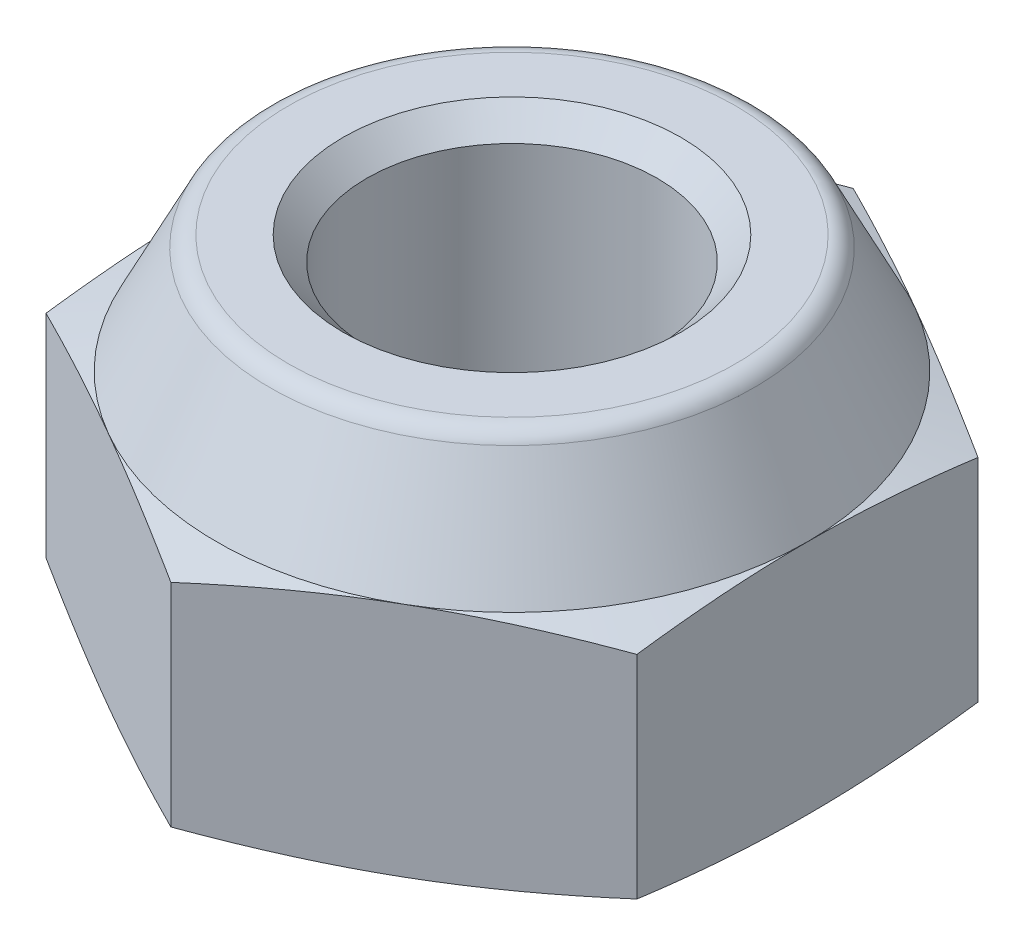
ISO-10303-21;
HEADER;
FILE_DESCRIPTION(('STEP AP214'),'2;1');
FILE_NAME('part.step','',(''),(''),'','','');
FILE_SCHEMA(('AUTOMOTIVE_DESIGN { 1 0 10303 214 1 1 1 1 }'));
ENDSEC;
DATA;
#1=APPLICATION_CONTEXT('core data for automotive mechanical design processes');
#2=APPLICATION_PROTOCOL_DEFINITION('international standard','automotive_design',2000,#1);
#3=PRODUCT_CONTEXT('',#1,'mechanical');
#4=PRODUCT('Part','Part','',(#3));
#5=PRODUCT_RELATED_PRODUCT_CATEGORY('part','',(#4));
#6=PRODUCT_DEFINITION_FORMATION('','',#4);
#7=PRODUCT_DEFINITION_CONTEXT('part definition',#1,'design');
#8=PRODUCT_DEFINITION('design','',#6,#7);
#9=PRODUCT_DEFINITION_SHAPE('','',#8);
#10=(LENGTH_UNIT() NAMED_UNIT(*) SI_UNIT(.MILLI.,.METRE.));
#11=(NAMED_UNIT(*) PLANE_ANGLE_UNIT() SI_UNIT($,.RADIAN.));
#12=(NAMED_UNIT(*) SI_UNIT($,.STERADIAN.) SOLID_ANGLE_UNIT());
#13=UNCERTAINTY_MEASURE_WITH_UNIT(LENGTH_MEASURE(1.E-05),#10,'distance_accuracy_value','');
#14=(GEOMETRIC_REPRESENTATION_CONTEXT(3) GLOBAL_UNCERTAINTY_ASSIGNED_CONTEXT((#13)) GLOBAL_UNIT_ASSIGNED_CONTEXT((#10,
#11,#12)) REPRESENTATION_CONTEXT('',''));
#15=CARTESIAN_POINT('',(0.,0.,0.));
#16=DIRECTION('',(0.,0.,1.));
#17=DIRECTION('',(1.,0.,0.));
#18=AXIS2_PLACEMENT_3D('',#15,#16,#17);
#19=CARTESIAN_POINT('',(0.,6.,0.));
#20=DIRECTION('',(0.,-1.,0.));
#21=DIRECTION('',(0.,0.,-1.));
#22=AXIS2_PLACEMENT_3D('',#19,#20,#21);
#23=PLANE('',#22);
#24=CARTESIAN_POINT('',(0.,6.,0.));
#25=DIRECTION('',(0.,-1.,0.));
#26=DIRECTION('',(0.,0.,-1.));
#27=AXIS2_PLACEMENT_3D('',#24,#25,#26);
#28=CIRCLE('',#27,2.8585);
#29=CARTESIAN_POINT('',(0.,6.,-2.8585));
#30=VERTEX_POINT('',#29);
#31=EDGE_CURVE('E580',#30,#30,#28,.T.);
#32=ORIENTED_EDGE('',*,*,#31,.T.);
#33=EDGE_LOOP('',(#32));
#34=FACE_BOUND('',#33,.T.);
#35=CARTESIAN_POINT('',(0.,6.,0.));
#36=DIRECTION('',(0.,-1.,0.));
#37=DIRECTION('',(0.,0.,-1.));
#38=AXIS2_PLACEMENT_3D('',#35,#36,#37);
#39=CIRCLE('',#38,3.78368810393743);
#40=CARTESIAN_POINT('',(0.,6.,-3.78368810393743));
#41=VERTEX_POINT('',#40);
#42=EDGE_CURVE('E583',#41,#41,#39,.T.);
#43=ORIENTED_EDGE('',*,*,#42,.F.);
#44=EDGE_LOOP('',(#43));
#45=FACE_BOUND('',#44,.T.);
#46=ADVANCED_FACE('F17',(#34,#45),#23,.F.);
#47=CARTESIAN_POINT('',(0.,5.64999999999983,0.));
#48=DIRECTION('',(0.,-1.,0.));
#49=DIRECTION('',(0.,0.,-1.));
#50=AXIS2_PLACEMENT_3D('',#47,#48,#49);
#51=TOROIDAL_SURFACE('',#50,3.78368810393743,0.350000000000169);
#52=ORIENTED_EDGE('',*,*,#42,.T.);
#53=EDGE_LOOP('',(#52));
#54=FACE_BOUND('',#53,.T.);
#55=CARTESIAN_POINT('',(0.,5.806524758425,0.));
#56=DIRECTION('',(0.,-1.,0.));
#57=DIRECTION('',(0.,0.,-1.));
#58=AXIS2_PLACEMENT_3D('',#55,#56,#57);
#59=CIRCLE('',#58,4.0967376207875);
#60=CARTESIAN_POINT('',(0.,5.806524758425,-4.0967376207875));
#61=VERTEX_POINT('',#60);
#62=EDGE_CURVE('E148',#61,#61,#59,.T.);
#63=ORIENTED_EDGE('',*,*,#62,.F.);
#64=EDGE_LOOP('',(#63));
#65=FACE_BOUND('',#64,.T.);
#66=ADVANCED_FACE('F570',(#54,#65),#51,.T.);
#67=CARTESIAN_POINT('',(0.,5.806524758425,0.));
#68=DIRECTION('',(0.,-1.,0.));
#69=DIRECTION('',(0.,0.,-1.));
#70=AXIS2_PLACEMENT_3D('',#67,#68,#69);
#71=CONICAL_SURFACE('',#70,4.0967376207875,0.463647609000806);
#72=CARTESIAN_POINT('',(0.,4.,0.));
#73=DIRECTION('',(0.,-1.,0.));
#74=DIRECTION('',(0.50000000000001,0.,-0.866025403784433));
#75=AXIS2_PLACEMENT_3D('',#72,#73,#74);
#76=CIRCLE('',#75,5.);
#77=CARTESIAN_POINT('',(2.50000000000005,4.,-4.33012701892217));
#78=VERTEX_POINT('',#77);
#79=CARTESIAN_POINT('',(5.,4.,0.));
#80=VERTEX_POINT('',#79);
#81=EDGE_CURVE('E132',#78,#80,#76,.T.);
#82=ORIENTED_EDGE('',*,*,#81,.F.);
#83=CARTESIAN_POINT('',(0.,4.,0.));
#84=DIRECTION('',(0.,-1.,0.));
#85=DIRECTION('',(-0.50000000000001,0.,-0.866025403784433));
#86=AXIS2_PLACEMENT_3D('',#83,#84,#85);
#87=CIRCLE('',#86,5.);
#88=CARTESIAN_POINT('',(-2.50000000000005,4.,-4.33012701892217));
#89=VERTEX_POINT('',#88);
#90=EDGE_CURVE('E143',#89,#78,#87,.T.);
#91=ORIENTED_EDGE('',*,*,#90,.F.);
#92=CARTESIAN_POINT('',(0.,4.,0.));
#93=DIRECTION('',(0.,-1.,0.));
#94=DIRECTION('',(-1.,0.,0.));
#95=AXIS2_PLACEMENT_3D('',#92,#93,#94);
#96=CIRCLE('',#95,5.);
#97=CARTESIAN_POINT('',(-5.,4.,0.));
#98=VERTEX_POINT('',#97);
#99=EDGE_CURVE('E152',#98,#89,#96,.T.);
#100=ORIENTED_EDGE('',*,*,#99,.F.);
#101=CARTESIAN_POINT('',(0.,4.,0.));
#102=DIRECTION('',(0.,-1.,0.));
#103=DIRECTION('',(-0.500000000000009,0.,0.866025403784433));
#104=AXIS2_PLACEMENT_3D('',#101,#102,#103);
#105=CIRCLE('',#104,5.);
#106=CARTESIAN_POINT('',(-2.50000000000005,4.,4.33012701892217));
#107=VERTEX_POINT('',#106);
#108=EDGE_CURVE('E154',#107,#98,#105,.T.);
#109=ORIENTED_EDGE('',*,*,#108,.F.);
#110=CARTESIAN_POINT('',(0.,4.,0.));
#111=DIRECTION('',(0.,-1.,0.));
#112=DIRECTION('',(0.50000000000001,0.,0.866025403784433));
#113=AXIS2_PLACEMENT_3D('',#110,#111,#112);
#114=CIRCLE('',#113,5.);
#115=CARTESIAN_POINT('',(2.50000000000005,4.,4.33012701892217));
#116=VERTEX_POINT('',#115);
#117=EDGE_CURVE('E165',#116,#107,#114,.T.);
#118=ORIENTED_EDGE('',*,*,#117,.F.);
#119=CARTESIAN_POINT('',(0.,4.,0.));
#120=DIRECTION('',(0.,-1.,0.));
#121=DIRECTION('',(1.,0.,0.));
#122=AXIS2_PLACEMENT_3D('',#119,#120,#121);
#123=CIRCLE('',#122,5.);
#124=EDGE_CURVE('E147',#80,#116,#123,.T.);
#125=ORIENTED_EDGE('',*,*,#124,.F.);
#126=EDGE_LOOP('',(#82,#91,#100,#109,#118,#125));
#127=FACE_BOUND('',#126,.T.);
#128=ORIENTED_EDGE('',*,*,#62,.T.);
#129=EDGE_LOOP('',(#128));
#130=FACE_BOUND('',#129,.T.);
#131=ADVANCED_FACE('F140',(#127,#130),#71,.T.);
#132=CARTESIAN_POINT('',(0.,4.,0.));
#133=DIRECTION('',(0.,-1.,0.));
#134=DIRECTION('',(0.,0.,-1.));
#135=AXIS2_PLACEMENT_3D('',#132,#133,#134);
#136=CONICAL_SURFACE('',#135,5.,1.30899693899575);
#137=CARTESIAN_POINT('',(-2.50000000000005,4.,4.33012701892217));
#138=CARTESIAN_POINT('',(-2.91742640279352,4.,4.0891257729025));
#139=CARTESIAN_POINT('',(-3.33341692083685,3.9810548741823,3.84895353532985));
#140=CARTESIAN_POINT('',(-4.16754617694872,3.90945077234265,3.3673687847747));
#141=CARTESIAN_POINT('',(-4.584721111361,3.85698444601377,3.1265127240926));
#142=CARTESIAN_POINT('',(-5.00000000003527,3.79274057835765,2.88675134592774));
#143=B_SPLINE_CURVE_WITH_KNOTS('',3,(#137,#138,#139,#140,#141,#142),.UNSPECIFIED.,.F.,.F.,(4,2,
4),(2.88698228605588,4.33035795902993,5.77373363200397),.UNSPECIFIED.);
#144=CARTESIAN_POINT('',(-5.,3.79274057836311,2.8867513459481));
#145=VERTEX_POINT('',#144);
#146=EDGE_CURVE('E173',#107,#145,#143,.T.);
#147=ORIENTED_EDGE('',*,*,#146,.F.);
#148=ORIENTED_EDGE('',*,*,#108,.T.);
#149=CARTESIAN_POINT('',(-5.,3.79274057884869,2.88675134232365));
#150=CARTESIAN_POINT('',(-5.,3.85673262713977,2.40910819086845));
#151=CARTESIAN_POINT('',(-5.,3.90889964404098,1.9311751947153));
#152=CARTESIAN_POINT('',(-5.,3.98076156598478,0.96802648577754));
#153=CARTESIAN_POINT('',(-5.,3.99999987620716,0.483903345265922));
#154=CARTESIAN_POINT('',(-5.,3.99999999999939,4.77371612118277E-06));
#155=B_SPLINE_CURVE_WITH_KNOTS('',3,(#149,#150,#151,#152,#153,#154),.UNSPECIFIED.,.F.,.F.,(4,2,
4),(5.90985445442545,7.35450546166115,8.79915646889685),.UNSPECIFIED.);
#156=EDGE_CURVE('E481',#145,#98,#155,.T.);
#157=ORIENTED_EDGE('',*,*,#156,.F.);
#158=EDGE_LOOP('',(#147,#148,#157));
#159=FACE_BOUND('',#158,.T.);
#160=ADVANCED_FACE('F187',(#159),#136,.T.);
#161=ORIENTED_EDGE('',*,*,#117,.T.);
#162=CARTESIAN_POINT('',(3.52677956283465E-11,3.79274057835763,5.77350269191666));
#163=CARTESIAN_POINT('',(-0.415278888639018,3.85698444601376,5.53374131375179));
#164=CARTESIAN_POINT('',(-0.832453823051313,3.90945077234264,5.29288525306968));
#165=CARTESIAN_POINT('',(-1.66658307916322,3.9810548741823,4.81130050251452));
#166=CARTESIAN_POINT('',(-2.08257359720656,4.,4.57112826494186));
#167=CARTESIAN_POINT('',(-2.50000000000005,4.,4.33012701892217));
#168=B_SPLINE_CURVE_WITH_KNOTS('',3,(#162,#163,#164,#165,#166,#167),.UNSPECIFIED.,.F.,.F.,(4,2,
4),(0.00023094010767716,1.44360661308178,2.88698228605588),.UNSPECIFIED.);
#169=CARTESIAN_POINT('',(0.,3.79274057836309,5.7735026918963));
#170=VERTEX_POINT('',#169);
#171=EDGE_CURVE('E258',#170,#107,#168,.T.);
#172=ORIENTED_EDGE('',*,*,#171,.F.);
#173=CARTESIAN_POINT('',(2.50000000000005,4.,4.33012701892217));
#174=CARTESIAN_POINT('',(2.08257359720656,4.,4.57112826494186));
#175=CARTESIAN_POINT('',(1.66658307916322,3.9810548741823,4.81130050251451));
#176=CARTESIAN_POINT('',(0.832453823051316,3.90945077234264,5.29288525306968));
#177=CARTESIAN_POINT('',(0.41527888863902,3.85698444601376,5.53374131375179));
#178=CARTESIAN_POINT('',(-3.52666476268507E-11,3.79274057835763,5.77350269191666));
#179=B_SPLINE_CURVE_WITH_KNOTS('',3,(#173,#174,#175,#176,#177,#178),.UNSPECIFIED.,.F.,.F.,(4,2,
4),(2.88698228605576,4.33035795902987,5.77373363200397),.UNSPECIFIED.);
#180=EDGE_CURVE('E257',#116,#170,#179,.T.);
#181=ORIENTED_EDGE('',*,*,#180,.F.);
#182=EDGE_LOOP('',(#161,#172,#181));
#183=FACE_BOUND('',#182,.T.);
#184=ADVANCED_FACE('F197',(#183),#136,.T.);
#185=ORIENTED_EDGE('',*,*,#124,.T.);
#186=CARTESIAN_POINT('',(5.00000000003527,3.79274057835765,2.88675134592774));
#187=CARTESIAN_POINT('',(4.584721111361,3.85698444601377,3.1265127240926));
#188=CARTESIAN_POINT('',(4.16754617694872,3.90945077234265,3.3673687847747));
#189=CARTESIAN_POINT('',(3.33341692083685,3.9810548741823,3.84895353532985));
#190=CARTESIAN_POINT('',(2.91742640279352,4.,4.0891257729025));
#191=CARTESIAN_POINT('',(2.50000000000005,4.,4.33012701892217));
#192=B_SPLINE_CURVE_WITH_KNOTS('',3,(#186,#187,#188,#189,#190,#191),.UNSPECIFIED.,.F.,.F.,(4,2,
4),(0.000230940107676231,1.44360661308172,2.88698228605576),.UNSPECIFIED.);
#193=CARTESIAN_POINT('',(5.,3.79274057836311,2.8867513459481));
#194=VERTEX_POINT('',#193);
#195=EDGE_CURVE('E263',#194,#116,#192,.T.);
#196=ORIENTED_EDGE('',*,*,#195,.F.);
#197=CARTESIAN_POINT('',(5.,3.99999999999939,-4.77371611901437E-06));
#198=CARTESIAN_POINT('',(5.,4.00000012642146,0.494173763804613));
#199=CARTESIAN_POINT('',(5.,3.98008346483984,0.986439161312405));
#200=CARTESIAN_POINT('',(5.,3.90682459228383,1.94954335929095));
#201=CARTESIAN_POINT('',(5.,3.85536900052761,2.41928641532904));
#202=CARTESIAN_POINT('',(5.,3.79274060438282,2.88675115173431));
#203=B_SPLINE_CURVE_WITH_KNOTS('',3,(#197,#198,#199,#200,#201,#202),.UNSPECIFIED.,.F.,.F.,(4,2,
4),(8.79915646889686,10.2610602443896,11.650099917217),.UNSPECIFIED.);
#204=EDGE_CURVE('E268',#80,#194,#203,.T.);
#205=ORIENTED_EDGE('',*,*,#204,.F.);
#206=EDGE_LOOP('',(#185,#196,#205));
#207=FACE_BOUND('',#206,.T.);
#208=ADVANCED_FACE('F267',(#207),#136,.T.);
#209=ORIENTED_EDGE('',*,*,#81,.T.);
#210=CARTESIAN_POINT('',(5.,3.79274057884869,-2.88675134232365));
#211=CARTESIAN_POINT('',(5.,3.85673262713977,-2.40910819086844));
#212=CARTESIAN_POINT('',(5.,3.90889964404098,-1.9311751947153));
#213=CARTESIAN_POINT('',(5.,3.98076156598478,-0.968026485777538));
#214=CARTESIAN_POINT('',(5.,3.99999987620716,-0.48390334526592));
#215=CARTESIAN_POINT('',(5.,3.99999999999939,-4.77371611901437E-06));
#216=B_SPLINE_CURVE_WITH_KNOTS('',3,(#210,#211,#212,#213,#214,#215),.UNSPECIFIED.,.F.,.F.,(4,2,
4),(5.90985445442545,7.35450546166115,8.79915646889686),.UNSPECIFIED.);
#217=CARTESIAN_POINT('',(5.,3.79274057836311,-2.8867513459481));
#218=VERTEX_POINT('',#217);
#219=EDGE_CURVE('E133',#218,#80,#216,.T.);
#220=ORIENTED_EDGE('',*,*,#219,.F.);
#221=CARTESIAN_POINT('',(2.50000000000005,4.,-4.33012701892217));
#222=CARTESIAN_POINT('',(2.91742640279352,4.,-4.0891257729025));
#223=CARTESIAN_POINT('',(3.33341692083685,3.9810548741823,-3.84895353532985));
#224=CARTESIAN_POINT('',(4.16754617694872,3.90945077234265,-3.3673687847747));
#225=CARTESIAN_POINT('',(4.584721111361,3.85698444601377,-3.1265127240926));
#226=CARTESIAN_POINT('',(5.00000000003527,3.79274057835765,-2.88675134592774));
#227=B_SPLINE_CURVE_WITH_KNOTS('',3,(#221,#222,#223,#224,#225,#226),.UNSPECIFIED.,.F.,.F.,(4,2,
4),(2.88698228605588,4.33035795902993,5.77373363200397),.UNSPECIFIED.);
#228=EDGE_CURVE('E113',#78,#218,#227,.T.);
#229=ORIENTED_EDGE('',*,*,#228,.F.);
#230=EDGE_LOOP('',(#209,#220,#229));
#231=FACE_BOUND('',#230,.T.);
#232=ADVANCED_FACE('F131',(#231),#136,.T.);
#233=ORIENTED_EDGE('',*,*,#90,.T.);
#234=CARTESIAN_POINT('',(-3.52677956283465E-11,3.79274057835763,-5.77350269191666));
#235=CARTESIAN_POINT('',(0.415278888639019,3.85698444601376,-5.53374131375179));
#236=CARTESIAN_POINT('',(0.832453823051315,3.90945077234264,-5.29288525306968));
#237=CARTESIAN_POINT('',(1.66658307916322,3.9810548741823,-4.81130050251451));
#238=CARTESIAN_POINT('',(2.08257359720656,4.,-4.57112826494186));
#239=CARTESIAN_POINT('',(2.50000000000005,4.,-4.33012701892217));
#240=B_SPLINE_CURVE_WITH_KNOTS('',3,(#234,#235,#236,#237,#238,#239),.UNSPECIFIED.,.F.,.F.,(4,2,
4),(0.00023094010767716,1.44360661308178,2.88698228605588),.UNSPECIFIED.);
#241=CARTESIAN_POINT('',(0.,3.79274057836309,-5.7735026918963));
#242=VERTEX_POINT('',#241);
#243=EDGE_CURVE('E108',#242,#78,#240,.T.);
#244=ORIENTED_EDGE('',*,*,#243,.F.);
#245=CARTESIAN_POINT('',(-2.50000000000005,4.,-4.33012701892217));
#246=CARTESIAN_POINT('',(-2.08257359720656,4.,-4.57112826494186));
#247=CARTESIAN_POINT('',(-1.66658307916322,3.9810548741823,-4.81130050251451));
#248=CARTESIAN_POINT('',(-0.832453823051316,3.90945077234264,-5.29288525306968));
#249=CARTESIAN_POINT('',(-0.41527888863902,3.85698444601376,-5.53374131375179));
#250=CARTESIAN_POINT('',(3.52660132341329E-11,3.79274057835763,-5.77350269191666));
#251=B_SPLINE_CURVE_WITH_KNOTS('',3,(#245,#246,#247,#248,#249,#250),.UNSPECIFIED.,.F.,.F.,(4,2,
4),(2.88698228605576,4.33035795902987,5.77373363200397),.UNSPECIFIED.);
#252=EDGE_CURVE('E123',#89,#242,#251,.T.);
#253=ORIENTED_EDGE('',*,*,#252,.F.);
#254=EDGE_LOOP('',(#233,#244,#253));
#255=FACE_BOUND('',#254,.T.);
#256=ADVANCED_FACE('F150',(#255),#136,.T.);
#257=ORIENTED_EDGE('',*,*,#99,.T.);
#258=CARTESIAN_POINT('',(-5.00000000003527,3.79274057835765,-2.88675134592774));
#259=CARTESIAN_POINT('',(-4.584721111361,3.85698444601377,-3.1265127240926));
#260=CARTESIAN_POINT('',(-4.16754617694872,3.90945077234265,-3.3673687847747));
#261=CARTESIAN_POINT('',(-3.33341692083685,3.9810548741823,-3.84895353532985));
#262=CARTESIAN_POINT('',(-2.91742640279353,4.,-4.0891257729025));
#263=CARTESIAN_POINT('',(-2.50000000000005,4.,-4.33012701892217));
#264=B_SPLINE_CURVE_WITH_KNOTS('',3,(#258,#259,#260,#261,#262,#263),.UNSPECIFIED.,.F.,.F.,(4,2,
4),(0.000230940107676231,1.44360661308172,2.88698228605576),.UNSPECIFIED.);
#265=CARTESIAN_POINT('',(-5.,3.79274057836311,-2.8867513459481));
#266=VERTEX_POINT('',#265);
#267=EDGE_CURVE('E424',#266,#89,#264,.T.);
#268=ORIENTED_EDGE('',*,*,#267,.F.);
#269=CARTESIAN_POINT('',(-5.,3.99999999999939,4.77371612118277E-06));
#270=CARTESIAN_POINT('',(-5.,4.00000012642146,-0.494173763804612));
#271=CARTESIAN_POINT('',(-5.,3.98008346483984,-0.986439161312404));
#272=CARTESIAN_POINT('',(-5.,3.90682459228383,-1.94954335929095));
#273=CARTESIAN_POINT('',(-5.,3.85536900052761,-2.41928641532904));
#274=CARTESIAN_POINT('',(-5.,3.79274060438282,-2.88675115173432));
#275=B_SPLINE_CURVE_WITH_KNOTS('',3,(#269,#270,#271,#272,#273,#274),.UNSPECIFIED.,.F.,.F.,(4,2,
4),(8.79915646889685,10.2610602443896,11.650099917217),.UNSPECIFIED.);
#276=EDGE_CURVE('E480',#98,#266,#275,.T.);
#277=ORIENTED_EDGE('',*,*,#276,.F.);
#278=EDGE_LOOP('',(#257,#268,#277));
#279=FACE_BOUND('',#278,.T.);
#280=ADVANCED_FACE('F198',(#279),#136,.T.);
#281=CARTESIAN_POINT('',(-5.,4.,2.8867513459481));
#282=DIRECTION('',(0.500000000000009,0.,-0.866025403784433));
#283=DIRECTION('',(-0.866025403784433,0.,-0.500000000000009));
#284=AXIS2_PLACEMENT_3D('',#281,#282,#283);
#285=PLANE('',#284);
#286=DIRECTION('',(0.,-1.,0.));
#287=VECTOR('',#286,1.);
#288=CARTESIAN_POINT('',(-5.,3.79274057836311,2.8867513459481));
#289=LINE('',#288,#287);
#290=CARTESIAN_POINT('',(-5.,0.207259421636899,2.8867513459481));
#291=VERTEX_POINT('',#290);
#292=EDGE_CURVE('E483',#145,#291,#289,.T.);
#293=ORIENTED_EDGE('',*,*,#292,.T.);
#294=CARTESIAN_POINT('',(-5.00000000003527,0.207259421642354,2.88675134592774));
#295=CARTESIAN_POINT('',(-4.584721111361,0.143015553986228,3.1265127240926));
#296=CARTESIAN_POINT('',(-4.16754617694872,0.0905492276573553,3.3673687847747));
#297=CARTESIAN_POINT('',(-3.33341692083684,0.018945125817702,3.84895353532985));
#298=CARTESIAN_POINT('',(-2.91742640279352,0.,4.0891257729025));
#299=CARTESIAN_POINT('',(-2.50000000000005,0.,4.33012701892217));
#300=B_SPLINE_CURVE_WITH_KNOTS('',3,(#294,#295,#296,#297,#298,#299),.UNSPECIFIED.,.F.,.F.,(4,2,
4),(0.000230940107674021,1.44360661308172,2.88698228605576),.UNSPECIFIED.);
#301=CARTESIAN_POINT('',(-2.50000000000005,0.,4.33012701892217));
#302=VERTEX_POINT('',#301);
#303=EDGE_CURVE('E859',#291,#302,#300,.T.);
#304=ORIENTED_EDGE('',*,*,#303,.T.);
#305=CARTESIAN_POINT('',(-2.50000000000005,0.,4.33012701892217));
#306=CARTESIAN_POINT('',(-2.08257359720656,0.,4.57112826494186));
#307=CARTESIAN_POINT('',(-1.66658307916322,0.0189451258177029,4.81130050251452));
#308=CARTESIAN_POINT('',(-0.832453823051313,0.0905492276573614,5.29288525306968));
#309=CARTESIAN_POINT('',(-0.415278888639018,0.143015553986238,5.53374131375179));
#310=CARTESIAN_POINT('',(3.52677956283465E-11,0.207259421642369,5.77350269191666));
#311=B_SPLINE_CURVE_WITH_KNOTS('',3,(#305,#306,#307,#308,#309,#310),.UNSPECIFIED.,.F.,.F.,(4,2,
4),(2.88698228605576,4.33035795902986,5.77373363200397),.UNSPECIFIED.);
#312=CARTESIAN_POINT('',(0.,0.207259421636915,5.7735026918963));
#313=VERTEX_POINT('',#312);
#314=EDGE_CURVE('E542',#302,#313,#311,.T.);
#315=ORIENTED_EDGE('',*,*,#314,.T.);
#316=DIRECTION('',(0.,-1.,0.));
#317=VECTOR('',#316,1.);
#318=CARTESIAN_POINT('',(0.,3.79274057836309,5.7735026918963));
#319=LINE('',#318,#317);
#320=EDGE_CURVE('E504',#170,#313,#319,.T.);
#321=ORIENTED_EDGE('',*,*,#320,.F.);
#322=ORIENTED_EDGE('',*,*,#171,.T.);
#323=ORIENTED_EDGE('',*,*,#146,.T.);
#324=EDGE_LOOP('',(#293,#304,#315,#321,#322,#323));
#325=FACE_BOUND('',#324,.T.);
#326=ADVANCED_FACE('F200',(#325),#285,.F.);
#327=CARTESIAN_POINT('',(0.,4.,5.7735026918963));
#328=DIRECTION('',(-0.500000000000009,0.,-0.866025403784433));
#329=DIRECTION('',(-0.866025403784433,0.,0.500000000000009));
#330=AXIS2_PLACEMENT_3D('',#327,#328,#329);
#331=PLANE('',#330);
#332=ORIENTED_EDGE('',*,*,#320,.T.);
#333=CARTESIAN_POINT('',(-3.52683106526997E-11,0.20725942164237,5.77350269191666));
#334=CARTESIAN_POINT('',(0.415278888639019,0.143015553986239,5.53374131375179));
#335=CARTESIAN_POINT('',(0.832453823051316,0.0905492276573622,5.29288525306968));
#336=CARTESIAN_POINT('',(1.66658307916322,0.0189451258177029,4.81130050251451));
#337=CARTESIAN_POINT('',(2.08257359720656,0.,4.57112826494186));
#338=CARTESIAN_POINT('',(2.50000000000005,0.,4.33012701892217));
#339=B_SPLINE_CURVE_WITH_KNOTS('',3,(#333,#334,#335,#336,#337,#338),.UNSPECIFIED.,.F.,.F.,(4,2,
4),(0.00023094010767713,1.44360661308178,2.88698228605588),.UNSPECIFIED.);
#340=CARTESIAN_POINT('',(2.50000000000005,0.,4.33012701892217));
#341=VERTEX_POINT('',#340);
#342=EDGE_CURVE('E501',#313,#341,#339,.T.);
#343=ORIENTED_EDGE('',*,*,#342,.T.);
#344=CARTESIAN_POINT('',(2.50000000000005,0.,4.33012701892217));
#345=CARTESIAN_POINT('',(2.91742640279352,0.,4.0891257729025));
#346=CARTESIAN_POINT('',(3.33341692083684,0.018945125817702,3.84895353532985));
#347=CARTESIAN_POINT('',(4.16754617694872,0.0905492276573553,3.3673687847747));
#348=CARTESIAN_POINT('',(4.584721111361,0.143015553986228,3.1265127240926));
#349=CARTESIAN_POINT('',(5.00000000003527,0.207259421642354,2.88675134592774));
#350=B_SPLINE_CURVE_WITH_KNOTS('',3,(#344,#345,#346,#347,#348,#349),.UNSPECIFIED.,.F.,.F.,(4,2,
4),(2.88698228605588,4.33035795902993,5.77373363200397),.UNSPECIFIED.);
#351=CARTESIAN_POINT('',(5.,0.207259421636899,2.8867513459481));
#352=VERTEX_POINT('',#351);
#353=EDGE_CURVE('E503',#341,#352,#350,.T.);
#354=ORIENTED_EDGE('',*,*,#353,.T.);
#355=DIRECTION('',(0.,-1.,0.));
#356=VECTOR('',#355,1.);
#357=CARTESIAN_POINT('',(5.,3.79274057836311,2.8867513459481));
#358=LINE('',#357,#356);
#359=EDGE_CURVE('E276',#194,#352,#358,.T.);
#360=ORIENTED_EDGE('',*,*,#359,.F.);
#361=ORIENTED_EDGE('',*,*,#195,.T.);
#362=ORIENTED_EDGE('',*,*,#180,.T.);
#363=EDGE_LOOP('',(#332,#343,#354,#360,#361,#362));
#364=FACE_BOUND('',#363,.T.);
#365=ADVANCED_FACE('F274',(#364),#331,.F.);
#366=CARTESIAN_POINT('',(5.,4.,2.8867513459481));
#367=DIRECTION('',(-1.,0.,0.));
#368=DIRECTION('',(0.,0.,1.));
#369=AXIS2_PLACEMENT_3D('',#366,#367,#368);
#370=PLANE('',#369);
#371=ORIENTED_EDGE('',*,*,#359,.T.);
#372=CARTESIAN_POINT('',(5.,0.207259421151314,2.88675134232365));
#373=CARTESIAN_POINT('',(5.,0.143267372860234,2.40910819086844));
#374=CARTESIAN_POINT('',(5.,0.0911003559590177,1.9311751947153));
#375=CARTESIAN_POINT('',(5.,0.0192384340152235,0.968026485777537));
#376=CARTESIAN_POINT('',(5.,1.23792837092296E-07,0.483903345265918));
#377=CARTESIAN_POINT('',(5.,6.09755301805848E-13,4.77371611771332E-06));
#378=B_SPLINE_CURVE_WITH_KNOTS('',3,(#372,#373,#374,#375,#376,#377),.UNSPECIFIED.,.F.,.F.,(4,2,
4),(5.90985445442545,7.35450546166116,8.79915646889686),.UNSPECIFIED.);
#379=CARTESIAN_POINT('',(5.,0.,0.));
#380=VERTEX_POINT('',#379);
#381=EDGE_CURVE('E315',#352,#380,#378,.T.);
#382=ORIENTED_EDGE('',*,*,#381,.T.);
#383=CARTESIAN_POINT('',(5.,6.09755301805848E-13,4.77371611771332E-06));
#384=CARTESIAN_POINT('',(5.,-1.26421465310167E-07,-0.494173763804616));
#385=CARTESIAN_POINT('',(5.,0.0199165351601619,-0.986439161312407));
#386=CARTESIAN_POINT('',(5.,0.0931754077161707,-1.94954335929096));
#387=CARTESIAN_POINT('',(5.,0.144630999472394,-2.41928641532904));
#388=CARTESIAN_POINT('',(5.,0.207259395617187,-2.88675115173432));
#389=B_SPLINE_CURVE_WITH_KNOTS('',3,(#383,#384,#385,#386,#387,#388),.UNSPECIFIED.,.F.,.F.,(4,2,
4),(8.79915646889686,10.2610602443896,11.650099917217),.UNSPECIFIED.);
#390=CARTESIAN_POINT('',(5.,0.207259421636899,-2.8867513459481));
#391=VERTEX_POINT('',#390);
#392=EDGE_CURVE('E326',#380,#391,#389,.T.);
#393=ORIENTED_EDGE('',*,*,#392,.T.);
#394=DIRECTION('',(0.,-1.,0.));
#395=VECTOR('',#394,1.);
#396=CARTESIAN_POINT('',(5.,3.79274057836311,-2.8867513459481));
#397=LINE('',#396,#395);
#398=EDGE_CURVE('E330',#218,#391,#397,.T.);
#399=ORIENTED_EDGE('',*,*,#398,.F.);
#400=ORIENTED_EDGE('',*,*,#219,.T.);
#401=ORIENTED_EDGE('',*,*,#204,.T.);
#402=EDGE_LOOP('',(#371,#382,#393,#399,#400,#401));
#403=FACE_BOUND('',#402,.T.);
#404=ADVANCED_FACE('F292',(#403),#370,.F.);
#405=CARTESIAN_POINT('',(5.,4.,-2.8867513459481));
#406=DIRECTION('',(-0.500000000000009,0.,0.866025403784433));
#407=DIRECTION('',(0.866025403784433,0.,0.500000000000009));
#408=AXIS2_PLACEMENT_3D('',#405,#406,#407);
#409=PLANE('',#408);
#410=ORIENTED_EDGE('',*,*,#398,.T.);
#411=CARTESIAN_POINT('',(5.00000000003527,0.207259421642354,-2.88675134592774));
#412=CARTESIAN_POINT('',(4.584721111361,0.143015553986228,-3.1265127240926));
#413=CARTESIAN_POINT('',(4.16754617694872,0.0905492276573553,-3.3673687847747));
#414=CARTESIAN_POINT('',(3.33341692083685,0.018945125817702,-3.84895353532985));
#415=CARTESIAN_POINT('',(2.91742640279352,0.,-4.0891257729025));
#416=CARTESIAN_POINT('',(2.50000000000005,0.,-4.33012701892217));
#417=B_SPLINE_CURVE_WITH_KNOTS('',3,(#411,#412,#413,#414,#415,#416),.UNSPECIFIED.,.F.,.F.,(4,2,
4),(0.000230940107674021,1.44360661308172,2.88698228605576),.UNSPECIFIED.);
#418=CARTESIAN_POINT('',(2.50000000000005,0.,-4.33012701892217));
#419=VERTEX_POINT('',#418);
#420=EDGE_CURVE('E337',#391,#419,#417,.T.);
#421=ORIENTED_EDGE('',*,*,#420,.T.);
#422=CARTESIAN_POINT('',(2.50000000000005,0.,-4.33012701892217));
#423=CARTESIAN_POINT('',(2.08257359720656,0.,-4.57112826494186));
#424=CARTESIAN_POINT('',(1.66658307916322,0.0189451258177029,-4.81130050251452));
#425=CARTESIAN_POINT('',(0.832453823051313,0.0905492276573614,-5.29288525306968));
#426=CARTESIAN_POINT('',(0.415278888639018,0.143015553986239,-5.53374131375179));
#427=CARTESIAN_POINT('',(-3.52677956283465E-11,0.20725942164237,-5.77350269191666));
#428=B_SPLINE_CURVE_WITH_KNOTS('',3,(#422,#423,#424,#425,#426,#427),.UNSPECIFIED.,.F.,.F.,(4,2,
4),(2.88698228605576,4.33035795902986,5.77373363200397),.UNSPECIFIED.);
#429=CARTESIAN_POINT('',(0.,0.207259421636915,-5.7735026918963));
#430=VERTEX_POINT('',#429);
#431=EDGE_CURVE('E937',#419,#430,#428,.T.);
#432=ORIENTED_EDGE('',*,*,#431,.T.);
#433=DIRECTION('',(0.,-1.,0.));
#434=VECTOR('',#433,1.);
#435=CARTESIAN_POINT('',(0.,3.79274057836309,-5.7735026918963));
#436=LINE('',#435,#434);
#437=EDGE_CURVE('E118',#242,#430,#436,.T.);
#438=ORIENTED_EDGE('',*,*,#437,.F.);
#439=ORIENTED_EDGE('',*,*,#243,.T.);
#440=ORIENTED_EDGE('',*,*,#228,.T.);
#441=EDGE_LOOP('',(#410,#421,#432,#438,#439,#440));
#442=FACE_BOUND('',#441,.T.);
#443=ADVANCED_FACE('F112',(#442),#409,.F.);
#444=CARTESIAN_POINT('',(0.,4.,-5.7735026918963));
#445=DIRECTION('',(0.500000000000009,0.,0.866025403784433));
#446=DIRECTION('',(0.866025403784433,0.,-0.500000000000009));
#447=AXIS2_PLACEMENT_3D('',#444,#445,#446);
#448=PLANE('',#447);
#449=ORIENTED_EDGE('',*,*,#437,.T.);
#450=CARTESIAN_POINT('',(3.52674264598014E-11,0.20725942164237,-5.77350269191666));
#451=CARTESIAN_POINT('',(-0.415278888639019,0.143015553986239,-5.53374131375179));
#452=CARTESIAN_POINT('',(-0.832453823051314,0.0905492276573622,-5.29288525306968));
#453=CARTESIAN_POINT('',(-1.66658307916322,0.0189451258177037,-4.81130050251452));
#454=CARTESIAN_POINT('',(-2.08257359720656,0.,-4.57112826494186));
#455=CARTESIAN_POINT('',(-2.50000000000005,0.,-4.33012701892217));
#456=B_SPLINE_CURVE_WITH_KNOTS('',3,(#450,#451,#452,#453,#454,#455),.UNSPECIFIED.,.F.,.F.,(4,2,
4),(0.00023094010767713,1.44360661308178,2.88698228605588),.UNSPECIFIED.);
#457=CARTESIAN_POINT('',(-2.50000000000005,0.,-4.33012701892217));
#458=VERTEX_POINT('',#457);
#459=EDGE_CURVE('E397',#430,#458,#456,.T.);
#460=ORIENTED_EDGE('',*,*,#459,.T.);
#461=CARTESIAN_POINT('',(-2.50000000000005,0.,-4.33012701892217));
#462=CARTESIAN_POINT('',(-2.91742640279352,0.,-4.0891257729025));
#463=CARTESIAN_POINT('',(-3.33341692083685,0.018945125817702,-3.84895353532985));
#464=CARTESIAN_POINT('',(-4.16754617694872,0.0905492276573553,-3.3673687847747));
#465=CARTESIAN_POINT('',(-4.584721111361,0.143015553986229,-3.1265127240926));
#466=CARTESIAN_POINT('',(-5.00000000003527,0.207259421642355,-2.88675134592774));
#467=B_SPLINE_CURVE_WITH_KNOTS('',3,(#461,#462,#463,#464,#465,#466),.UNSPECIFIED.,.F.,.F.,(4,2,
4),(2.88698228605588,4.33035795902993,5.77373363200397),.UNSPECIFIED.);
#468=CARTESIAN_POINT('',(-5.,0.207259421636899,-2.8867513459481));
#469=VERTEX_POINT('',#468);
#470=EDGE_CURVE('E408',#458,#469,#467,.T.);
#471=ORIENTED_EDGE('',*,*,#470,.T.);
#472=DIRECTION('',(0.,-1.,0.));
#473=VECTOR('',#472,1.);
#474=CARTESIAN_POINT('',(-5.,3.79274057836311,-2.8867513459481));
#475=LINE('',#474,#473);
#476=EDGE_CURVE('E413',#266,#469,#475,.T.);
#477=ORIENTED_EDGE('',*,*,#476,.F.);
#478=ORIENTED_EDGE('',*,*,#267,.T.);
#479=ORIENTED_EDGE('',*,*,#252,.T.);
#480=EDGE_LOOP('',(#449,#460,#471,#477,#478,#479));
#481=FACE_BOUND('',#480,.T.);
#482=ADVANCED_FACE('F372',(#481),#448,.F.);
#483=CARTESIAN_POINT('',(-5.,4.,-2.8867513459481));
#484=DIRECTION('',(1.,0.,0.));
#485=DIRECTION('',(0.,0.,-1.));
#486=AXIS2_PLACEMENT_3D('',#483,#484,#485);
#487=PLANE('',#486);
#488=ORIENTED_EDGE('',*,*,#476,.T.);
#489=CARTESIAN_POINT('',(-5.,0.207259421151314,-2.88675134232365));
#490=CARTESIAN_POINT('',(-5.,0.143267372860234,-2.40910819086844));
#491=CARTESIAN_POINT('',(-5.,0.0911003559590177,-1.9311751947153));
#492=CARTESIAN_POINT('',(-5.,0.0192384340152235,-0.968026485777539));
#493=CARTESIAN_POINT('',(-5.,1.23792837959658E-07,-0.483903345265921));
#494=CARTESIAN_POINT('',(-5.,6.09755301805848E-13,-4.77371612118277E-06));
#495=B_SPLINE_CURVE_WITH_KNOTS('',3,(#489,#490,#491,#492,#493,#494),.UNSPECIFIED.,.F.,.F.,(4,2,
4),(5.90985445442545,7.35450546166116,8.79915646889686),.UNSPECIFIED.);
#496=CARTESIAN_POINT('',(-5.,0.,0.));
#497=VERTEX_POINT('',#496);
#498=EDGE_CURVE('E39',#469,#497,#495,.T.);
#499=ORIENTED_EDGE('',*,*,#498,.T.);
#500=CARTESIAN_POINT('',(-5.,6.09755301805848E-13,-4.77371612118277E-06));
#501=CARTESIAN_POINT('',(-5.,-1.26421465310167E-07,0.494173763804613));
#502=CARTESIAN_POINT('',(-5.,0.0199165351601619,0.986439161312407));
#503=CARTESIAN_POINT('',(-5.,0.0931754077161699,1.94954335929096));
#504=CARTESIAN_POINT('',(-5.,0.144630999472394,2.41928641532904));
#505=CARTESIAN_POINT('',(-5.,0.207259395617187,2.88675115173432));
#506=B_SPLINE_CURVE_WITH_KNOTS('',3,(#500,#501,#502,#503,#504,#505),.UNSPECIFIED.,.F.,.F.,(4,2,
4),(8.79915646889686,10.2610602443896,11.650099917217),.UNSPECIFIED.);
#507=EDGE_CURVE('E861',#497,#291,#506,.T.);
#508=ORIENTED_EDGE('',*,*,#507,.T.);
#509=ORIENTED_EDGE('',*,*,#292,.F.);
#510=ORIENTED_EDGE('',*,*,#156,.T.);
#511=ORIENTED_EDGE('',*,*,#276,.T.);
#512=EDGE_LOOP('',(#488,#499,#508,#509,#510,#511));
#513=FACE_BOUND('',#512,.T.);
#514=ADVANCED_FACE('F450',(#513),#487,.F.);
#515=CARTESIAN_POINT('',(0.,0.669872981077811,0.));
#516=DIRECTION('',(0.,1.,0.));
#517=DIRECTION('',(0.,0.,1.));
#518=AXIS2_PLACEMENT_3D('',#515,#516,#517);
#519=CONICAL_SURFACE('',#518,7.5,1.30899693899575);
#520=ORIENTED_EDGE('',*,*,#507,.F.);
#521=CARTESIAN_POINT('',(0.,0.,0.));
#522=DIRECTION('',(0.,-1.,0.));
#523=DIRECTION('',(-0.500000000000009,0.,0.866025403784433));
#524=AXIS2_PLACEMENT_3D('',#521,#522,#523);
#525=CIRCLE('',#524,5.);
#526=EDGE_CURVE('E32',#302,#497,#525,.T.);
#527=ORIENTED_EDGE('',*,*,#526,.F.);
#528=ORIENTED_EDGE('',*,*,#303,.F.);
#529=EDGE_LOOP('',(#520,#527,#528));
#530=FACE_BOUND('',#529,.T.);
#531=ADVANCED_FACE('F459',(#530),#519,.T.);
#532=CARTESIAN_POINT('',(0.,0.,0.));
#533=DIRECTION('',(0.,-1.,0.));
#534=DIRECTION('',(-1.,0.,0.));
#535=AXIS2_PLACEMENT_3D('',#532,#533,#534);
#536=CIRCLE('',#535,5.);
#537=EDGE_CURVE('E862',#497,#458,#536,.T.);
#538=ORIENTED_EDGE('',*,*,#537,.F.);
#539=ORIENTED_EDGE('',*,*,#498,.F.);
#540=ORIENTED_EDGE('',*,*,#470,.F.);
#541=EDGE_LOOP('',(#538,#539,#540));
#542=FACE_BOUND('',#541,.T.);
#543=ADVANCED_FACE('F660',(#542),#519,.T.);
#544=CARTESIAN_POINT('',(0.,0.,0.));
#545=DIRECTION('',(0.,-1.,0.));
#546=DIRECTION('',(-0.50000000000001,0.,-0.866025403784433));
#547=AXIS2_PLACEMENT_3D('',#544,#545,#546);
#548=CIRCLE('',#547,5.);
#549=EDGE_CURVE('E887',#458,#419,#548,.T.);
#550=ORIENTED_EDGE('',*,*,#549,.F.);
#551=ORIENTED_EDGE('',*,*,#459,.F.);
#552=ORIENTED_EDGE('',*,*,#431,.F.);
#553=EDGE_LOOP('',(#550,#551,#552));
#554=FACE_BOUND('',#553,.T.);
#555=ADVANCED_FACE('F668',(#554),#519,.T.);
#556=CARTESIAN_POINT('',(0.,0.,0.));
#557=DIRECTION('',(0.,-1.,0.));
#558=DIRECTION('',(0.50000000000001,0.,-0.866025403784433));
#559=AXIS2_PLACEMENT_3D('',#556,#557,#558);
#560=CIRCLE('',#559,5.);
#561=EDGE_CURVE('E923',#419,#380,#560,.T.);
#562=ORIENTED_EDGE('',*,*,#561,.F.);
#563=ORIENTED_EDGE('',*,*,#420,.F.);
#564=ORIENTED_EDGE('',*,*,#392,.F.);
#565=EDGE_LOOP('',(#562,#563,#564));
#566=FACE_BOUND('',#565,.T.);
#567=ADVANCED_FACE('F674',(#566),#519,.T.);
#568=CARTESIAN_POINT('',(0.,0.,0.));
#569=DIRECTION('',(0.,-1.,0.));
#570=DIRECTION('',(1.,0.,0.));
#571=AXIS2_PLACEMENT_3D('',#568,#569,#570);
#572=CIRCLE('',#571,5.);
#573=EDGE_CURVE('E514',#380,#341,#572,.T.);
#574=ORIENTED_EDGE('',*,*,#573,.F.);
#575=ORIENTED_EDGE('',*,*,#381,.F.);
#576=ORIENTED_EDGE('',*,*,#353,.F.);
#577=EDGE_LOOP('',(#574,#575,#576));
#578=FACE_BOUND('',#577,.T.);
#579=ADVANCED_FACE('F513',(#578),#519,.T.);
#580=CARTESIAN_POINT('',(0.,0.,0.));
#581=DIRECTION('',(0.,-1.,0.));
#582=DIRECTION('',(0.50000000000001,0.,0.866025403784433));
#583=AXIS2_PLACEMENT_3D('',#580,#581,#582);
#584=CIRCLE('',#583,5.);
#585=EDGE_CURVE('E523',#341,#302,#584,.T.);
#586=ORIENTED_EDGE('',*,*,#585,.F.);
#587=ORIENTED_EDGE('',*,*,#342,.F.);
#588=ORIENTED_EDGE('',*,*,#314,.F.);
#589=EDGE_LOOP('',(#586,#587,#588));
#590=FACE_BOUND('',#589,.T.);
#591=ADVANCED_FACE('F662',(#590),#519,.T.);
#592=CARTESIAN_POINT('',(6.,0.,0.));
#593=DIRECTION('',(0.,1.,0.));
#594=DIRECTION('',(0.,0.,1.));
#595=AXIS2_PLACEMENT_3D('',#592,#593,#594);
#596=PLANE('',#595);
#597=CARTESIAN_POINT('',(0.,0.,0.));
#598=DIRECTION('',(0.,-1.,0.));
#599=DIRECTION('',(0.,0.,-1.));
#600=AXIS2_PLACEMENT_3D('',#597,#598,#599);
#601=CIRCLE('',#600,3.);
#602=CARTESIAN_POINT('',(0.,0.,-3.));
#603=VERTEX_POINT('',#602);
#604=EDGE_CURVE('E530',#603,#603,#601,.T.);
#605=ORIENTED_EDGE('',*,*,#604,.F.);
#606=EDGE_LOOP('',(#605));
#607=FACE_BOUND('',#606,.T.);
#608=ORIENTED_EDGE('',*,*,#585,.T.);
#609=ORIENTED_EDGE('',*,*,#526,.T.);
#610=ORIENTED_EDGE('',*,*,#537,.T.);
#611=ORIENTED_EDGE('',*,*,#549,.T.);
#612=ORIENTED_EDGE('',*,*,#561,.T.);
#613=ORIENTED_EDGE('',*,*,#573,.T.);
#614=EDGE_LOOP('',(#608,#609,#610,#611,#612,#613));
#615=FACE_BOUND('',#614,.T.);
#616=ADVANCED_FACE('F567',(#607,#615),#596,.F.);
#617=CARTESIAN_POINT('',(0.,6.,0.));
#618=DIRECTION('',(0.,1.,0.));
#619=DIRECTION('',(0.,0.,1.));
#620=AXIS2_PLACEMENT_3D('',#617,#618,#619);
#621=CONICAL_SURFACE('',#620,2.8585,0.785398163397448);
#622=CARTESIAN_POINT('',(0.,5.6,0.));
#623=DIRECTION('',(0.,-1.,0.));
#624=DIRECTION('',(0.,0.,-1.));
#625=AXIS2_PLACEMENT_3D('',#622,#623,#624);
#626=CIRCLE('',#625,2.4585);
#627=CARTESIAN_POINT('',(0.,5.6,-2.4585));
#628=VERTEX_POINT('',#627);
#629=EDGE_CURVE('E25',#628,#628,#626,.T.);
#630=ORIENTED_EDGE('',*,*,#629,.T.);
#631=EDGE_LOOP('',(#630));
#632=FACE_BOUND('',#631,.T.);
#633=ORIENTED_EDGE('',*,*,#31,.F.);
#634=EDGE_LOOP('',(#633));
#635=FACE_BOUND('',#634,.T.);
#636=ADVANCED_FACE('F555',(#632,#635),#621,.F.);
#637=CARTESIAN_POINT('',(0.,0.,0.));
#638=DIRECTION('',(0.,-1.,0.));
#639=DIRECTION('',(0.,0.,-1.));
#640=AXIS2_PLACEMENT_3D('',#637,#638,#639);
#641=CYLINDRICAL_SURFACE('',#640,2.4585);
#642=CARTESIAN_POINT('',(0.,0.5415,0.));
#643=DIRECTION('',(0.,-1.,0.));
#644=DIRECTION('',(0.,0.,-1.));
#645=AXIS2_PLACEMENT_3D('',#642,#643,#644);
#646=CIRCLE('',#645,2.4585);
#647=CARTESIAN_POINT('',(0.,0.5415,-2.4585));
#648=VERTEX_POINT('',#647);
#649=EDGE_CURVE('E11',#648,#648,#646,.T.);
#650=ORIENTED_EDGE('',*,*,#649,.T.);
#651=EDGE_LOOP('',(#650));
#652=FACE_BOUND('',#651,.T.);
#653=ORIENTED_EDGE('',*,*,#629,.F.);
#654=EDGE_LOOP('',(#653));
#655=FACE_BOUND('',#654,.T.);
#656=ADVANCED_FACE('F558',(#652,#655),#641,.F.);
#657=CARTESIAN_POINT('',(0.,0.5415,0.));
#658=DIRECTION('',(0.,-1.,0.));
#659=DIRECTION('',(0.,0.,-1.));
#660=AXIS2_PLACEMENT_3D('',#657,#658,#659);
#661=CONICAL_SURFACE('',#660,2.4585,0.785398163397448);
#662=ORIENTED_EDGE('',*,*,#604,.T.);
#663=EDGE_LOOP('',(#662));
#664=FACE_BOUND('',#663,.T.);
#665=ORIENTED_EDGE('',*,*,#649,.F.);
#666=EDGE_LOOP('',(#665));
#667=FACE_BOUND('',#666,.T.);
#668=ADVANCED_FACE('F19',(#664,#667),#661,.F.);
#669=CLOSED_SHELL('',(#46,#66,#131,#160,#184,#208,#232,#256,#280,#326,#365,#404,#443,#482,#514,
#531,#543,#555,#567,#579,#591,#616,#636,#656,#668));
#670=MANIFOLD_SOLID_BREP('B1',#669);
#671=ADVANCED_BREP_SHAPE_REPRESENTATION('',(#18,#670),#14);
#672=SHAPE_DEFINITION_REPRESENTATION(#9,#671);
ENDSEC;
END-ISO-10303-21;
